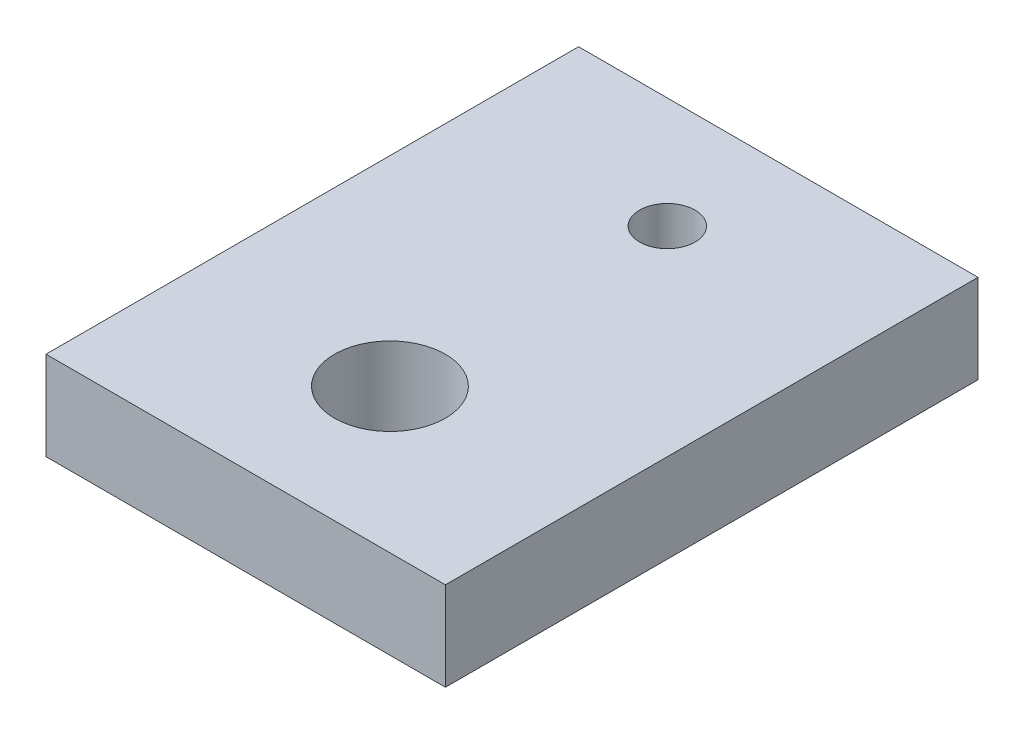
ISO-10303-21;
HEADER;
FILE_DESCRIPTION(('STEP AP214'),'2;1');
FILE_NAME('part.step','',(''),(''),'','','');
FILE_SCHEMA(('AUTOMOTIVE_DESIGN { 1 0 10303 214 1 1 1 1 }'));
ENDSEC;
DATA;
#1=APPLICATION_CONTEXT('core data for automotive mechanical design processes');
#2=APPLICATION_PROTOCOL_DEFINITION('international standard','automotive_design',2000,#1);
#3=PRODUCT_CONTEXT('',#1,'mechanical');
#4=PRODUCT('Part','Part','',(#3));
#5=PRODUCT_RELATED_PRODUCT_CATEGORY('part','',(#4));
#6=PRODUCT_DEFINITION_FORMATION('','',#4);
#7=PRODUCT_DEFINITION_CONTEXT('part definition',#1,'design');
#8=PRODUCT_DEFINITION('design','',#6,#7);
#9=PRODUCT_DEFINITION_SHAPE('','',#8);
#10=(LENGTH_UNIT() NAMED_UNIT(*) SI_UNIT(.MILLI.,.METRE.));
#11=(NAMED_UNIT(*) PLANE_ANGLE_UNIT() SI_UNIT($,.RADIAN.));
#12=(NAMED_UNIT(*) SI_UNIT($,.STERADIAN.) SOLID_ANGLE_UNIT());
#13=UNCERTAINTY_MEASURE_WITH_UNIT(LENGTH_MEASURE(1.E-05),#10,'distance_accuracy_value','');
#14=(GEOMETRIC_REPRESENTATION_CONTEXT(3) GLOBAL_UNCERTAINTY_ASSIGNED_CONTEXT((#13)) GLOBAL_UNIT_ASSIGNED_CONTEXT((#10,
#11,#12)) REPRESENTATION_CONTEXT('',''));
#15=CARTESIAN_POINT('',(0.,0.,0.));
#16=DIRECTION('',(0.,0.,1.));
#17=DIRECTION('',(1.,0.,0.));
#18=AXIS2_PLACEMENT_3D('',#15,#16,#17);
#19=CARTESIAN_POINT('',(-21.4606451612903,8.,35.7367741935484));
#20=DIRECTION('',(0.,0.,-1.));
#21=DIRECTION('',(-1.,0.,0.));
#22=AXIS2_PLACEMENT_3D('',#19,#20,#21);
#23=PLANE('',#22);
#24=DIRECTION('',(1.,0.,0.));
#25=VECTOR('',#24,1.);
#26=CARTESIAN_POINT('',(-21.4606451612903,0.,35.7367741935484));
#27=LINE('',#26,#25);
#28=CARTESIAN_POINT('',(-21.4606451612903,0.,35.7367741935484));
#29=VERTEX_POINT('',#28);
#30=CARTESIAN_POINT('',(14.5393548387097,0.,35.7367741935484));
#31=VERTEX_POINT('',#30);
#32=EDGE_CURVE('E96',#29,#31,#27,.T.);
#33=ORIENTED_EDGE('',*,*,#32,.T.);
#34=DIRECTION('',(0.,-1.,0.));
#35=VECTOR('',#34,1.);
#36=CARTESIAN_POINT('',(14.5393548387097,8.,35.7367741935484));
#37=LINE('',#36,#35);
#38=CARTESIAN_POINT('',(14.5393548387097,8.,35.7367741935484));
#39=VERTEX_POINT('',#38);
#40=EDGE_CURVE('E11',#39,#31,#37,.T.);
#41=ORIENTED_EDGE('',*,*,#40,.F.);
#42=DIRECTION('',(1.,0.,0.));
#43=VECTOR('',#42,1.);
#44=CARTESIAN_POINT('',(-21.4606451612903,8.,35.7367741935484));
#45=LINE('',#44,#43);
#46=CARTESIAN_POINT('',(-21.4606451612903,8.,35.7367741935484));
#47=VERTEX_POINT('',#46);
#48=EDGE_CURVE('E73',#47,#39,#45,.T.);
#49=ORIENTED_EDGE('',*,*,#48,.F.);
#50=DIRECTION('',(0.,-1.,0.));
#51=VECTOR('',#50,1.);
#52=CARTESIAN_POINT('',(-21.4606451612903,8.,35.7367741935484));
#53=LINE('',#52,#51);
#54=EDGE_CURVE('E92',#47,#29,#53,.T.);
#55=ORIENTED_EDGE('',*,*,#54,.T.);
#56=EDGE_LOOP('',(#33,#41,#49,#55));
#57=FACE_BOUND('',#56,.T.);
#58=ADVANCED_FACE('F34',(#57),#23,.F.);
#59=CARTESIAN_POINT('',(14.5393548387097,8.,-12.2632258064516));
#60=DIRECTION('',(1.,0.,0.));
#61=DIRECTION('',(0.,0.,-1.));
#62=AXIS2_PLACEMENT_3D('',#59,#60,#61);
#63=PLANE('',#62);
#64=DIRECTION('',(0.,0.,1.));
#65=VECTOR('',#64,1.);
#66=CARTESIAN_POINT('',(14.5393548387097,0.,-12.2632258064516));
#67=LINE('',#66,#65);
#68=CARTESIAN_POINT('',(14.5393548387097,0.,-12.2632258064516));
#69=VERTEX_POINT('',#68);
#70=EDGE_CURVE('E82',#69,#31,#67,.T.);
#71=ORIENTED_EDGE('',*,*,#70,.F.);
#72=DIRECTION('',(0.,-1.,0.));
#73=VECTOR('',#72,1.);
#74=CARTESIAN_POINT('',(14.5393548387097,8.,-12.2632258064516));
#75=LINE('',#74,#73);
#76=CARTESIAN_POINT('',(14.5393548387097,8.,-12.2632258064516));
#77=VERTEX_POINT('',#76);
#78=EDGE_CURVE('E42',#77,#69,#75,.T.);
#79=ORIENTED_EDGE('',*,*,#78,.F.);
#80=DIRECTION('',(0.,0.,1.));
#81=VECTOR('',#80,1.);
#82=CARTESIAN_POINT('',(14.5393548387097,8.,-12.2632258064516));
#83=LINE('',#82,#81);
#84=EDGE_CURVE('E80',#77,#39,#83,.T.);
#85=ORIENTED_EDGE('',*,*,#84,.T.);
#86=ORIENTED_EDGE('',*,*,#40,.T.);
#87=EDGE_LOOP('',(#71,#79,#85,#86));
#88=FACE_BOUND('',#87,.T.);
#89=ADVANCED_FACE('F79',(#88),#63,.T.);
#90=CARTESIAN_POINT('',(-21.4606451612903,8.,-12.2632258064516));
#91=DIRECTION('',(0.,0.,-1.));
#92=DIRECTION('',(-1.,0.,0.));
#93=AXIS2_PLACEMENT_3D('',#90,#91,#92);
#94=PLANE('',#93);
#95=DIRECTION('',(1.,0.,0.));
#96=VECTOR('',#95,1.);
#97=CARTESIAN_POINT('',(-21.4606451612903,0.,-12.2632258064516));
#98=LINE('',#97,#96);
#99=CARTESIAN_POINT('',(-21.4606451612903,0.,-12.2632258064516));
#100=VERTEX_POINT('',#99);
#101=EDGE_CURVE('E101',#100,#69,#98,.T.);
#102=ORIENTED_EDGE('',*,*,#101,.F.);
#103=DIRECTION('',(0.,-1.,0.));
#104=VECTOR('',#103,1.);
#105=CARTESIAN_POINT('',(-21.4606451612903,8.,-12.2632258064516));
#106=LINE('',#105,#104);
#107=CARTESIAN_POINT('',(-21.4606451612903,8.,-12.2632258064516));
#108=VERTEX_POINT('',#107);
#109=EDGE_CURVE('E65',#108,#100,#106,.T.);
#110=ORIENTED_EDGE('',*,*,#109,.F.);
#111=DIRECTION('',(1.,0.,0.));
#112=VECTOR('',#111,1.);
#113=CARTESIAN_POINT('',(-21.4606451612903,8.,-12.2632258064516));
#114=LINE('',#113,#112);
#115=EDGE_CURVE('E88',#108,#77,#114,.T.);
#116=ORIENTED_EDGE('',*,*,#115,.T.);
#117=ORIENTED_EDGE('',*,*,#78,.T.);
#118=EDGE_LOOP('',(#102,#110,#116,#117));
#119=FACE_BOUND('',#118,.T.);
#120=ADVANCED_FACE('F90',(#119),#94,.T.);
#121=CARTESIAN_POINT('',(-21.4606451612903,8.,-12.2632258064516));
#122=DIRECTION('',(1.,0.,0.));
#123=DIRECTION('',(0.,0.,-1.));
#124=AXIS2_PLACEMENT_3D('',#121,#122,#123);
#125=PLANE('',#124);
#126=DIRECTION('',(0.,0.,1.));
#127=VECTOR('',#126,1.);
#128=CARTESIAN_POINT('',(-21.4606451612903,0.,-12.2632258064516));
#129=LINE('',#128,#127);
#130=EDGE_CURVE('E68',#100,#29,#129,.T.);
#131=ORIENTED_EDGE('',*,*,#130,.T.);
#132=ORIENTED_EDGE('',*,*,#54,.F.);
#133=DIRECTION('',(0.,0.,1.));
#134=VECTOR('',#133,1.);
#135=CARTESIAN_POINT('',(-21.4606451612903,8.,-12.2632258064516));
#136=LINE('',#135,#134);
#137=EDGE_CURVE('E50',#108,#47,#136,.T.);
#138=ORIENTED_EDGE('',*,*,#137,.F.);
#139=ORIENTED_EDGE('',*,*,#109,.T.);
#140=EDGE_LOOP('',(#131,#132,#138,#139));
#141=FACE_BOUND('',#140,.T.);
#142=ADVANCED_FACE('F120',(#141),#125,.F.);
#143=CARTESIAN_POINT('',(0.,8.,0.));
#144=DIRECTION('',(0.,-1.,0.));
#145=DIRECTION('',(0.,0.,-1.));
#146=AXIS2_PLACEMENT_3D('',#143,#144,#145);
#147=PLANE('',#146);
#148=CARTESIAN_POINT('',(-3.46064516129033,8.,22.7367741935484));
#149=DIRECTION('',(0.,1.,0.));
#150=DIRECTION('',(0.,0.,1.));
#151=AXIS2_PLACEMENT_3D('',#148,#149,#150);
#152=CIRCLE('',#151,5.);
#153=CARTESIAN_POINT('',(-3.46064516129033,8.,27.7367741935484));
#154=VERTEX_POINT('',#153);
#155=EDGE_CURVE('E171',#154,#154,#152,.T.);
#156=ORIENTED_EDGE('',*,*,#155,.F.);
#157=EDGE_LOOP('',(#156));
#158=FACE_BOUND('',#157,.T.);
#159=CARTESIAN_POINT('',(-3.46064516129033,8.,-2.26322580645161));
#160=DIRECTION('',(0.,1.,0.));
#161=DIRECTION('',(0.,0.,1.));
#162=AXIS2_PLACEMENT_3D('',#159,#160,#161);
#163=CIRCLE('',#162,2.5);
#164=CARTESIAN_POINT('',(-3.46064516129033,8.,0.236774193548386));
#165=VERTEX_POINT('',#164);
#166=EDGE_CURVE('E99',#165,#165,#163,.T.);
#167=ORIENTED_EDGE('',*,*,#166,.F.);
#168=EDGE_LOOP('',(#167));
#169=FACE_BOUND('',#168,.T.);
#170=ORIENTED_EDGE('',*,*,#48,.T.);
#171=ORIENTED_EDGE('',*,*,#84,.F.);
#172=ORIENTED_EDGE('',*,*,#115,.F.);
#173=ORIENTED_EDGE('',*,*,#137,.T.);
#174=EDGE_LOOP('',(#170,#171,#172,#173));
#175=FACE_BOUND('',#174,.T.);
#176=ADVANCED_FACE('F87',(#158,#169,#175),#147,.F.);
#177=CARTESIAN_POINT('',(0.,0.,0.));
#178=DIRECTION('',(0.,-1.,0.));
#179=DIRECTION('',(0.,0.,-1.));
#180=AXIS2_PLACEMENT_3D('',#177,#178,#179);
#181=PLANE('',#180);
#182=CARTESIAN_POINT('',(-3.46064516129033,0.,22.7367741935484));
#183=DIRECTION('',(0.,1.,0.));
#184=DIRECTION('',(0.,0.,1.));
#185=AXIS2_PLACEMENT_3D('',#182,#183,#184);
#186=CIRCLE('',#185,5.);
#187=CARTESIAN_POINT('',(-3.46064516129033,0.,27.7367741935484));
#188=VERTEX_POINT('',#187);
#189=EDGE_CURVE('E168',#188,#188,#186,.T.);
#190=ORIENTED_EDGE('',*,*,#189,.T.);
#191=EDGE_LOOP('',(#190));
#192=FACE_BOUND('',#191,.T.);
#193=CARTESIAN_POINT('',(-3.46064516129033,0.,-2.26322580645161));
#194=DIRECTION('',(0.,1.,0.));
#195=DIRECTION('',(0.,0.,1.));
#196=AXIS2_PLACEMENT_3D('',#193,#194,#195);
#197=CIRCLE('',#196,2.5);
#198=CARTESIAN_POINT('',(-3.46064516129033,0.,0.236774193548385));
#199=VERTEX_POINT('',#198);
#200=EDGE_CURVE('E172',#199,#199,#197,.T.);
#201=ORIENTED_EDGE('',*,*,#200,.T.);
#202=EDGE_LOOP('',(#201));
#203=FACE_BOUND('',#202,.T.);
#204=ORIENTED_EDGE('',*,*,#32,.F.);
#205=ORIENTED_EDGE('',*,*,#130,.F.);
#206=ORIENTED_EDGE('',*,*,#101,.T.);
#207=ORIENTED_EDGE('',*,*,#70,.T.);
#208=EDGE_LOOP('',(#204,#205,#206,#207));
#209=FACE_BOUND('',#208,.T.);
#210=ADVANCED_FACE('F108',(#192,#203,#209),#181,.T.);
#211=CARTESIAN_POINT('',(-3.46064516129033,8.,-2.26322580645161));
#212=DIRECTION('',(0.,1.,0.));
#213=DIRECTION('',(0.,0.,1.));
#214=AXIS2_PLACEMENT_3D('',#211,#212,#213);
#215=CYLINDRICAL_SURFACE('',#214,2.5);
#216=ORIENTED_EDGE('',*,*,#200,.F.);
#217=EDGE_LOOP('',(#216));
#218=FACE_BOUND('',#217,.T.);
#219=ORIENTED_EDGE('',*,*,#166,.T.);
#220=EDGE_LOOP('',(#219));
#221=FACE_BOUND('',#220,.T.);
#222=ADVANCED_FACE('F110',(#218,#221),#215,.F.);
#223=CARTESIAN_POINT('',(-3.46064516129033,8.,22.7367741935484));
#224=DIRECTION('',(0.,1.,0.));
#225=DIRECTION('',(0.,0.,1.));
#226=AXIS2_PLACEMENT_3D('',#223,#224,#225);
#227=CYLINDRICAL_SURFACE('',#226,5.);
#228=ORIENTED_EDGE('',*,*,#189,.F.);
#229=EDGE_LOOP('',(#228));
#230=FACE_BOUND('',#229,.T.);
#231=ORIENTED_EDGE('',*,*,#155,.T.);
#232=EDGE_LOOP('',(#231));
#233=FACE_BOUND('',#232,.T.);
#234=ADVANCED_FACE('F117',(#230,#233),#227,.F.);
#235=CLOSED_SHELL('',(#58,#89,#120,#142,#176,#210,#222,#234));
#236=MANIFOLD_SOLID_BREP('B2',#235);
#237=ADVANCED_BREP_SHAPE_REPRESENTATION('',(#18,#236),#14);
#238=SHAPE_DEFINITION_REPRESENTATION(#9,#237);
ENDSEC;
END-ISO-10303-21;
